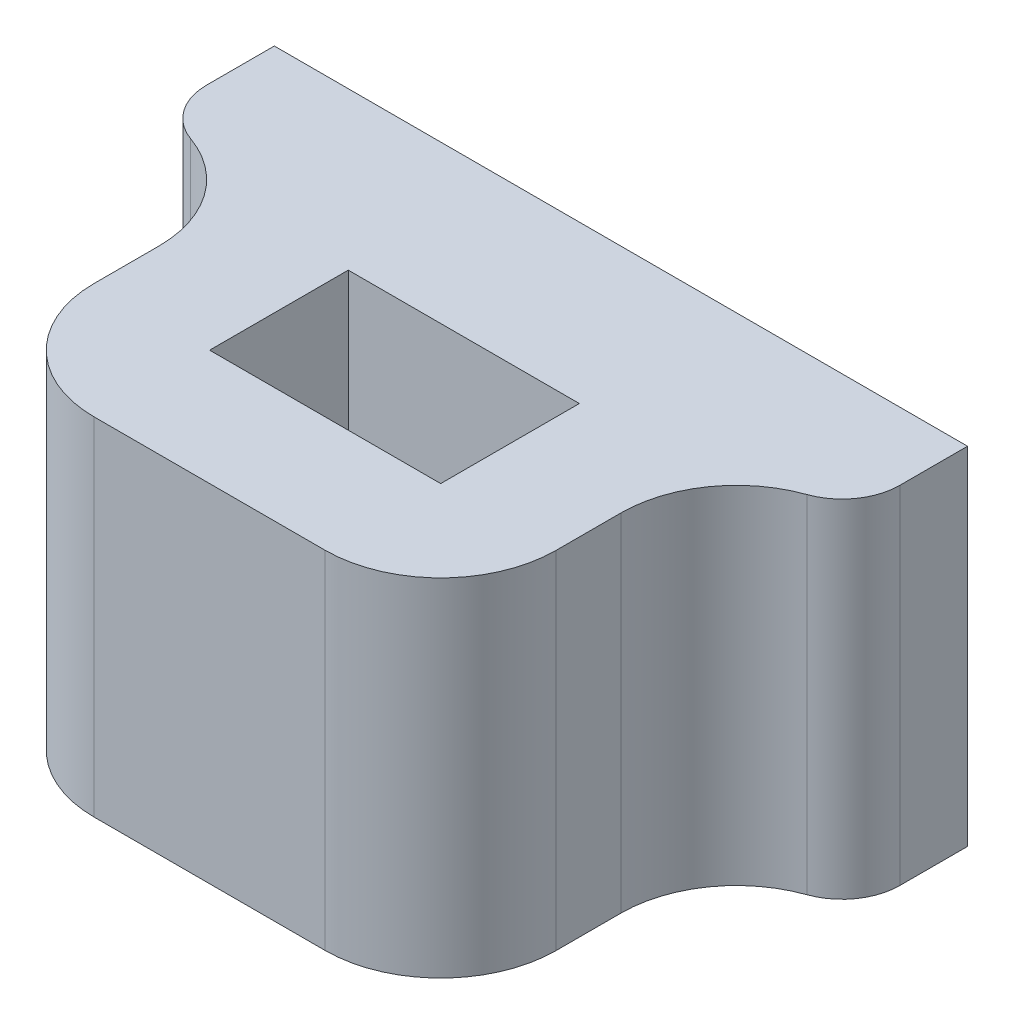
ISO-10303-21;
HEADER;
FILE_DESCRIPTION(('STEP AP214'),'2;1');
FILE_NAME('part.step','',(''),(''),'','','');
FILE_SCHEMA(('AUTOMOTIVE_DESIGN { 1 0 10303 214 1 1 1 1 }'));
ENDSEC;
DATA;
#1=APPLICATION_CONTEXT('core data for automotive mechanical design processes');
#2=APPLICATION_PROTOCOL_DEFINITION('international standard','automotive_design',2000,#1);
#3=PRODUCT_CONTEXT('',#1,'mechanical');
#4=PRODUCT('Part','Part','',(#3));
#5=PRODUCT_RELATED_PRODUCT_CATEGORY('part','',(#4));
#6=PRODUCT_DEFINITION_FORMATION('','',#4);
#7=PRODUCT_DEFINITION_CONTEXT('part definition',#1,'design');
#8=PRODUCT_DEFINITION('design','',#6,#7);
#9=PRODUCT_DEFINITION_SHAPE('','',#8);
#10=(LENGTH_UNIT() NAMED_UNIT(*) SI_UNIT(.MILLI.,.METRE.));
#11=(NAMED_UNIT(*) PLANE_ANGLE_UNIT() SI_UNIT($,.RADIAN.));
#12=(NAMED_UNIT(*) SI_UNIT($,.STERADIAN.) SOLID_ANGLE_UNIT());
#13=UNCERTAINTY_MEASURE_WITH_UNIT(LENGTH_MEASURE(1.E-05),#10,'distance_accuracy_value','');
#14=(GEOMETRIC_REPRESENTATION_CONTEXT(3) GLOBAL_UNCERTAINTY_ASSIGNED_CONTEXT((#13)) GLOBAL_UNIT_ASSIGNED_CONTEXT((#10,
#11,#12)) REPRESENTATION_CONTEXT('',''));
#15=CARTESIAN_POINT('',(0.,0.,0.));
#16=DIRECTION('',(0.,0.,1.));
#17=DIRECTION('',(1.,0.,0.));
#18=AXIS2_PLACEMENT_3D('',#15,#16,#17);
#19=CARTESIAN_POINT('',(9.525,4.7625,3.175));
#20=DIRECTION('',(-1.,0.,0.));
#21=DIRECTION('',(0.,-1.,0.));
#22=AXIS2_PLACEMENT_3D('',#19,#20,#21);
#23=PLANE('',#22);
#24=DIRECTION('',(0.,0.,-1.));
#25=VECTOR('',#24,1.);
#26=CARTESIAN_POINT('',(9.525,4.7625,3.175));
#27=LINE('',#26,#25);
#28=CARTESIAN_POINT('',(9.525,4.7625,1.85987193946542));
#29=VERTEX_POINT('',#28);
#30=CARTESIAN_POINT('',(9.525,4.7625,0.));
#31=VERTEX_POINT('',#30);
#32=EDGE_CURVE('E228',#29,#31,#27,.T.);
#33=ORIENTED_EDGE('',*,*,#32,.F.);
#34=DIRECTION('',(0.,1.,0.));
#35=VECTOR('',#34,1.);
#36=CARTESIAN_POINT('',(9.525,4.7625,1.85987193946542));
#37=LINE('',#36,#35);
#38=CARTESIAN_POINT('',(9.525,-4.7625,1.85987193946542));
#39=VERTEX_POINT('',#38);
#40=EDGE_CURVE('E11',#29,#39,#37,.F.);
#41=ORIENTED_EDGE('',*,*,#40,.T.);
#42=DIRECTION('',(0.,0.,-1.));
#43=VECTOR('',#42,1.);
#44=CARTESIAN_POINT('',(9.525,-4.7625,3.175));
#45=LINE('',#44,#43);
#46=CARTESIAN_POINT('',(9.525,-4.7625,0.));
#47=VERTEX_POINT('',#46);
#48=EDGE_CURVE('E222',#39,#47,#45,.T.);
#49=ORIENTED_EDGE('',*,*,#48,.T.);
#50=DIRECTION('',(0.,1.,0.));
#51=VECTOR('',#50,1.);
#52=CARTESIAN_POINT('',(9.525,4.7625,0.));
#53=LINE('',#52,#51);
#54=EDGE_CURVE('E210',#47,#31,#53,.T.);
#55=ORIENTED_EDGE('',*,*,#54,.T.);
#56=EDGE_LOOP('',(#33,#41,#49,#55));
#57=FACE_BOUND('',#56,.T.);
#58=ADVANCED_FACE('F38',(#57),#23,.F.);
#59=CARTESIAN_POINT('',(-9.525,4.7625,3.175));
#60=DIRECTION('',(0.,-1.,0.));
#61=DIRECTION('',(0.,0.,-1.));
#62=AXIS2_PLACEMENT_3D('',#59,#60,#61);
#63=PLANE('',#62);
#64=DIRECTION('',(1.,0.,0.));
#65=VECTOR('',#64,1.);
#66=CARTESIAN_POINT('',(-3.175,4.7625,4.318));
#67=LINE('',#66,#65);
#68=CARTESIAN_POINT('',(-3.175,4.7625,4.318));
#69=VERTEX_POINT('',#68);
#70=CARTESIAN_POINT('',(3.175,4.7625,4.318));
#71=VERTEX_POINT('',#70);
#72=EDGE_CURVE('E162',#69,#71,#67,.T.);
#73=ORIENTED_EDGE('',*,*,#72,.T.);
#74=DIRECTION('',(0.,0.,1.));
#75=VECTOR('',#74,1.);
#76=CARTESIAN_POINT('',(3.175,4.7625,8.128));
#77=LINE('',#76,#75);
#78=CARTESIAN_POINT('',(3.175,4.7625,8.128));
#79=VERTEX_POINT('',#78);
#80=EDGE_CURVE('E154',#71,#79,#77,.T.);
#81=ORIENTED_EDGE('',*,*,#80,.T.);
#82=DIRECTION('',(-1.,0.,0.));
#83=VECTOR('',#82,1.);
#84=CARTESIAN_POINT('',(-3.175,4.7625,8.128));
#85=LINE('',#84,#83);
#86=CARTESIAN_POINT('',(-3.175,4.7625,8.128));
#87=VERTEX_POINT('',#86);
#88=EDGE_CURVE('E166',#79,#87,#85,.T.);
#89=ORIENTED_EDGE('',*,*,#88,.T.);
#90=DIRECTION('',(0.,0.,-1.));
#91=VECTOR('',#90,1.);
#92=CARTESIAN_POINT('',(-3.175,4.7625,8.128));
#93=LINE('',#92,#91);
#94=EDGE_CURVE('E170',#87,#69,#93,.T.);
#95=ORIENTED_EDGE('',*,*,#94,.T.);
#96=EDGE_LOOP('',(#73,#81,#89,#95));
#97=FACE_BOUND('',#96,.T.);
#98=DIRECTION('',(0.,0.,-1.));
#99=VECTOR('',#98,1.);
#100=CARTESIAN_POINT('',(-9.525,4.7625,3.175));
#101=LINE('',#100,#99);
#102=CARTESIAN_POINT('',(-9.525,4.7625,1.85987193946542));
#103=VERTEX_POINT('',#102);
#104=CARTESIAN_POINT('',(-9.525,4.7625,0.));
#105=VERTEX_POINT('',#104);
#106=EDGE_CURVE('E226',#103,#105,#101,.T.);
#107=ORIENTED_EDGE('',*,*,#106,.F.);
#108=CARTESIAN_POINT('',(-7.9375,4.7625,1.85987193946542));
#109=DIRECTION('',(0.,-1.,0.));
#110=DIRECTION('',(0.,0.,-1.));
#111=AXIS2_PLACEMENT_3D('',#108,#109,#110);
#112=CIRCLE('',#111,1.5875);
#113=CARTESIAN_POINT('',(-8.46666666666667,4.7625,3.35658129297695));
#114=VERTEX_POINT('',#113);
#115=EDGE_CURVE('E273',#103,#114,#112,.F.);
#116=ORIENTED_EDGE('',*,*,#115,.T.);
#117=CARTESIAN_POINT('',(-9.525,4.7625,6.35));
#118=DIRECTION('',(0.,-1.,0.));
#119=DIRECTION('',(0.,0.,-1.));
#120=AXIS2_PLACEMENT_3D('',#117,#118,#119);
#121=CIRCLE('',#120,3.175);
#122=CARTESIAN_POINT('',(-6.35,4.7625,6.35));
#123=VERTEX_POINT('',#122);
#124=EDGE_CURVE('E261',#114,#123,#121,.T.);
#125=ORIENTED_EDGE('',*,*,#124,.T.);
#126=DIRECTION('',(0.,0.,-1.));
#127=VECTOR('',#126,1.);
#128=CARTESIAN_POINT('',(-6.35,4.7625,11.303));
#129=LINE('',#128,#127);
#130=CARTESIAN_POINT('',(-6.35,4.7625,8.128));
#131=VERTEX_POINT('',#130);
#132=EDGE_CURVE('E204',#131,#123,#129,.T.);
#133=ORIENTED_EDGE('',*,*,#132,.F.);
#134=CARTESIAN_POINT('',(-3.175,4.7625,8.128));
#135=DIRECTION('',(0.,-1.,0.));
#136=DIRECTION('',(0.,0.,-1.));
#137=AXIS2_PLACEMENT_3D('',#134,#135,#136);
#138=CIRCLE('',#137,3.175);
#139=CARTESIAN_POINT('',(-3.175,4.7625,11.303));
#140=VERTEX_POINT('',#139);
#141=EDGE_CURVE('E247',#131,#140,#138,.F.);
#142=ORIENTED_EDGE('',*,*,#141,.T.);
#143=DIRECTION('',(-1.,0.,0.));
#144=VECTOR('',#143,1.);
#145=CARTESIAN_POINT('',(-6.35,4.7625,11.303));
#146=LINE('',#145,#144);
#147=CARTESIAN_POINT('',(3.175,4.7625,11.303));
#148=VERTEX_POINT('',#147);
#149=EDGE_CURVE('E189',#148,#140,#146,.T.);
#150=ORIENTED_EDGE('',*,*,#149,.F.);
#151=CARTESIAN_POINT('',(3.175,4.7625,8.128));
#152=DIRECTION('',(0.,-1.,0.));
#153=DIRECTION('',(0.,0.,-1.));
#154=AXIS2_PLACEMENT_3D('',#151,#152,#153);
#155=CIRCLE('',#154,3.175);
#156=CARTESIAN_POINT('',(6.35,4.7625,8.128));
#157=VERTEX_POINT('',#156);
#158=EDGE_CURVE('E245',#148,#157,#155,.F.);
#159=ORIENTED_EDGE('',*,*,#158,.T.);
#160=DIRECTION('',(0.,0.,-1.));
#161=VECTOR('',#160,1.);
#162=CARTESIAN_POINT('',(6.35,4.7625,11.303));
#163=LINE('',#162,#161);
#164=CARTESIAN_POINT('',(6.35,4.7625,6.35));
#165=VERTEX_POINT('',#164);
#166=EDGE_CURVE('E207',#157,#165,#163,.T.);
#167=ORIENTED_EDGE('',*,*,#166,.T.);
#168=CARTESIAN_POINT('',(9.525,4.7625,6.35));
#169=DIRECTION('',(0.,-1.,0.));
#170=DIRECTION('',(0.,0.,-1.));
#171=AXIS2_PLACEMENT_3D('',#168,#169,#170);
#172=CIRCLE('',#171,3.175);
#173=CARTESIAN_POINT('',(8.46666666666666,4.7625,3.35658129297695));
#174=VERTEX_POINT('',#173);
#175=EDGE_CURVE('E254',#165,#174,#172,.T.);
#176=ORIENTED_EDGE('',*,*,#175,.T.);
#177=CARTESIAN_POINT('',(7.9375,4.7625,1.85987193946542));
#178=DIRECTION('',(0.,-1.,0.));
#179=DIRECTION('',(0.,0.,-1.));
#180=AXIS2_PLACEMENT_3D('',#177,#178,#179);
#181=CIRCLE('',#180,1.5875);
#182=EDGE_CURVE('E53',#174,#29,#181,.F.);
#183=ORIENTED_EDGE('',*,*,#182,.T.);
#184=ORIENTED_EDGE('',*,*,#32,.T.);
#185=DIRECTION('',(-1.,0.,0.));
#186=VECTOR('',#185,1.);
#187=CARTESIAN_POINT('',(-9.525,4.7625,0.));
#188=LINE('',#187,#186);
#189=EDGE_CURVE('E213',#31,#105,#188,.T.);
#190=ORIENTED_EDGE('',*,*,#189,.T.);
#191=EDGE_LOOP('',(#107,#116,#125,#133,#142,#150,#159,#167,#176,#183,#184,#190));
#192=FACE_BOUND('',#191,.T.);
#193=ADVANCED_FACE('F172',(#97,#192),#63,.F.);
#194=CARTESIAN_POINT('',(-9.525,4.7625,3.175));
#195=DIRECTION('',(1.,0.,0.));
#196=DIRECTION('',(0.,1.,0.));
#197=AXIS2_PLACEMENT_3D('',#194,#195,#196);
#198=PLANE('',#197);
#199=DIRECTION('',(0.,0.,-1.));
#200=VECTOR('',#199,1.);
#201=CARTESIAN_POINT('',(-9.525,-4.7625,3.175));
#202=LINE('',#201,#200);
#203=CARTESIAN_POINT('',(-9.525,-4.7625,1.85987193946542));
#204=VERTEX_POINT('',#203);
#205=CARTESIAN_POINT('',(-9.525,-4.7625,0.));
#206=VERTEX_POINT('',#205);
#207=EDGE_CURVE('E224',#204,#206,#202,.T.);
#208=ORIENTED_EDGE('',*,*,#207,.F.);
#209=DIRECTION('',(0.,-1.,0.));
#210=VECTOR('',#209,1.);
#211=CARTESIAN_POINT('',(-9.525,4.7625,1.85987193946542));
#212=LINE('',#211,#210);
#213=EDGE_CURVE('E270',#204,#103,#212,.F.);
#214=ORIENTED_EDGE('',*,*,#213,.T.);
#215=ORIENTED_EDGE('',*,*,#106,.T.);
#216=DIRECTION('',(0.,-1.,0.));
#217=VECTOR('',#216,1.);
#218=CARTESIAN_POINT('',(-9.525,4.7625,0.));
#219=LINE('',#218,#217);
#220=EDGE_CURVE('E216',#105,#206,#219,.T.);
#221=ORIENTED_EDGE('',*,*,#220,.T.);
#222=EDGE_LOOP('',(#208,#214,#215,#221));
#223=FACE_BOUND('',#222,.T.);
#224=ADVANCED_FACE('F313',(#223),#198,.F.);
#225=CARTESIAN_POINT('',(-9.525,-4.7625,3.175));
#226=DIRECTION('',(0.,1.,0.));
#227=DIRECTION('',(0.,0.,1.));
#228=AXIS2_PLACEMENT_3D('',#225,#226,#227);
#229=PLANE('',#228);
#230=DIRECTION('',(-1.,0.,0.));
#231=VECTOR('',#230,1.);
#232=CARTESIAN_POINT('',(-3.175,-4.7625,8.128));
#233=LINE('',#232,#231);
#234=CARTESIAN_POINT('',(3.175,-4.7625,8.128));
#235=VERTEX_POINT('',#234);
#236=CARTESIAN_POINT('',(-3.175,-4.7625,8.128));
#237=VERTEX_POINT('',#236);
#238=EDGE_CURVE('E183',#235,#237,#233,.T.);
#239=ORIENTED_EDGE('',*,*,#238,.F.);
#240=DIRECTION('',(0.,0.,1.));
#241=VECTOR('',#240,1.);
#242=CARTESIAN_POINT('',(3.175,-4.7625,8.128));
#243=LINE('',#242,#241);
#244=CARTESIAN_POINT('',(3.175,-4.7625,4.318));
#245=VERTEX_POINT('',#244);
#246=EDGE_CURVE('E157',#245,#235,#243,.T.);
#247=ORIENTED_EDGE('',*,*,#246,.F.);
#248=DIRECTION('',(1.,0.,0.));
#249=VECTOR('',#248,1.);
#250=CARTESIAN_POINT('',(-3.175,-4.7625,4.318));
#251=LINE('',#250,#249);
#252=CARTESIAN_POINT('',(-3.175,-4.7625,4.318));
#253=VERTEX_POINT('',#252);
#254=EDGE_CURVE('E174',#253,#245,#251,.T.);
#255=ORIENTED_EDGE('',*,*,#254,.F.);
#256=DIRECTION('',(0.,0.,-1.));
#257=VECTOR('',#256,1.);
#258=CARTESIAN_POINT('',(-3.175,-4.7625,8.128));
#259=LINE('',#258,#257);
#260=EDGE_CURVE('E177',#237,#253,#259,.T.);
#261=ORIENTED_EDGE('',*,*,#260,.F.);
#262=EDGE_LOOP('',(#239,#247,#255,#261));
#263=FACE_BOUND('',#262,.T.);
#264=CARTESIAN_POINT('',(-9.525,-4.7625,6.35));
#265=DIRECTION('',(0.,1.,0.));
#266=DIRECTION('',(0.,0.,1.));
#267=AXIS2_PLACEMENT_3D('',#264,#265,#266);
#268=CIRCLE('',#267,3.175);
#269=CARTESIAN_POINT('',(-6.35,-4.7625,6.35));
#270=VERTEX_POINT('',#269);
#271=CARTESIAN_POINT('',(-8.46666666666667,-4.7625,3.35658129297695));
#272=VERTEX_POINT('',#271);
#273=EDGE_CURVE('E258',#270,#272,#268,.T.);
#274=ORIENTED_EDGE('',*,*,#273,.T.);
#275=CARTESIAN_POINT('',(-7.9375,-4.7625,1.85987193946542));
#276=DIRECTION('',(0.,1.,0.));
#277=DIRECTION('',(0.,0.,1.));
#278=AXIS2_PLACEMENT_3D('',#275,#276,#277);
#279=CIRCLE('',#278,1.5875);
#280=EDGE_CURVE('E268',#272,#204,#279,.F.);
#281=ORIENTED_EDGE('',*,*,#280,.T.);
#282=ORIENTED_EDGE('',*,*,#207,.T.);
#283=DIRECTION('',(1.,0.,0.));
#284=VECTOR('',#283,1.);
#285=CARTESIAN_POINT('',(-9.525,-4.7625,0.));
#286=LINE('',#285,#284);
#287=EDGE_CURVE('E219',#206,#47,#286,.T.);
#288=ORIENTED_EDGE('',*,*,#287,.T.);
#289=ORIENTED_EDGE('',*,*,#48,.F.);
#290=CARTESIAN_POINT('',(7.9375,-4.7625,1.85987193946542));
#291=DIRECTION('',(0.,1.,0.));
#292=DIRECTION('',(0.,0.,1.));
#293=AXIS2_PLACEMENT_3D('',#290,#291,#292);
#294=CIRCLE('',#293,1.5875);
#295=CARTESIAN_POINT('',(8.46666666666666,-4.7625,3.35658129297695));
#296=VERTEX_POINT('',#295);
#297=EDGE_CURVE('E266',#39,#296,#294,.F.);
#298=ORIENTED_EDGE('',*,*,#297,.T.);
#299=CARTESIAN_POINT('',(9.525,-4.7625,6.35));
#300=DIRECTION('',(0.,1.,0.));
#301=DIRECTION('',(0.,0.,1.));
#302=AXIS2_PLACEMENT_3D('',#299,#300,#301);
#303=CIRCLE('',#302,3.175);
#304=CARTESIAN_POINT('',(6.35,-4.7625,6.35));
#305=VERTEX_POINT('',#304);
#306=EDGE_CURVE('E256',#296,#305,#303,.T.);
#307=ORIENTED_EDGE('',*,*,#306,.T.);
#308=DIRECTION('',(0.,0.,-1.));
#309=VECTOR('',#308,1.);
#310=CARTESIAN_POINT('',(6.35,-4.7625,11.303));
#311=LINE('',#310,#309);
#312=CARTESIAN_POINT('',(6.35,-4.7625,8.128));
#313=VERTEX_POINT('',#312);
#314=EDGE_CURVE('E198',#313,#305,#311,.T.);
#315=ORIENTED_EDGE('',*,*,#314,.F.);
#316=CARTESIAN_POINT('',(3.175,-4.7625,8.128));
#317=DIRECTION('',(0.,1.,0.));
#318=DIRECTION('',(0.,0.,1.));
#319=AXIS2_PLACEMENT_3D('',#316,#317,#318);
#320=CIRCLE('',#319,3.175);
#321=CARTESIAN_POINT('',(3.175,-4.7625,11.303));
#322=VERTEX_POINT('',#321);
#323=EDGE_CURVE('E236',#313,#322,#320,.F.);
#324=ORIENTED_EDGE('',*,*,#323,.T.);
#325=DIRECTION('',(1.,0.,0.));
#326=VECTOR('',#325,1.);
#327=CARTESIAN_POINT('',(-6.35,-4.7625,11.303));
#328=LINE('',#327,#326);
#329=CARTESIAN_POINT('',(-3.175,-4.7625,11.303));
#330=VERTEX_POINT('',#329);
#331=EDGE_CURVE('E195',#330,#322,#328,.T.);
#332=ORIENTED_EDGE('',*,*,#331,.F.);
#333=CARTESIAN_POINT('',(-3.175,-4.7625,8.128));
#334=DIRECTION('',(0.,1.,0.));
#335=DIRECTION('',(0.,0.,1.));
#336=AXIS2_PLACEMENT_3D('',#333,#334,#335);
#337=CIRCLE('',#336,3.175);
#338=CARTESIAN_POINT('',(-6.35,-4.7625,8.128));
#339=VERTEX_POINT('',#338);
#340=EDGE_CURVE('E238',#330,#339,#337,.F.);
#341=ORIENTED_EDGE('',*,*,#340,.T.);
#342=DIRECTION('',(0.,0.,-1.));
#343=VECTOR('',#342,1.);
#344=CARTESIAN_POINT('',(-6.35,-4.7625,11.303));
#345=LINE('',#344,#343);
#346=EDGE_CURVE('E201',#339,#270,#345,.T.);
#347=ORIENTED_EDGE('',*,*,#346,.T.);
#348=EDGE_LOOP('',(#274,#281,#282,#288,#289,#298,#307,#315,#324,#332,#341,#347));
#349=FACE_BOUND('',#348,.T.);
#350=ADVANCED_FACE('F292',(#263,#349),#229,.F.);
#351=CARTESIAN_POINT('',(0.,0.,0.));
#352=DIRECTION('',(0.,0.,1.));
#353=DIRECTION('',(1.,0.,0.));
#354=AXIS2_PLACEMENT_3D('',#351,#352,#353);
#355=PLANE('',#354);
#356=ORIENTED_EDGE('',*,*,#54,.F.);
#357=ORIENTED_EDGE('',*,*,#287,.F.);
#358=ORIENTED_EDGE('',*,*,#220,.F.);
#359=ORIENTED_EDGE('',*,*,#189,.F.);
#360=EDGE_LOOP('',(#356,#357,#358,#359));
#361=FACE_BOUND('',#360,.T.);
#362=ADVANCED_FACE('F321',(#361),#355,.F.);
#363=CARTESIAN_POINT('',(6.35,4.7625,11.303));
#364=DIRECTION('',(-1.,0.,0.));
#365=DIRECTION('',(0.,0.,1.));
#366=AXIS2_PLACEMENT_3D('',#363,#364,#365);
#367=PLANE('',#366);
#368=ORIENTED_EDGE('',*,*,#166,.F.);
#369=DIRECTION('',(0.,1.,0.));
#370=VECTOR('',#369,1.);
#371=CARTESIAN_POINT('',(6.35,-4.7625,8.128));
#372=LINE('',#371,#370);
#373=EDGE_CURVE('E252',#157,#313,#372,.F.);
#374=ORIENTED_EDGE('',*,*,#373,.T.);
#375=ORIENTED_EDGE('',*,*,#314,.T.);
#376=DIRECTION('',(0.,1.,0.));
#377=VECTOR('',#376,1.);
#378=CARTESIAN_POINT('',(6.35,4.7625,6.35));
#379=LINE('',#378,#377);
#380=EDGE_CURVE('E249',#305,#165,#379,.T.);
#381=ORIENTED_EDGE('',*,*,#380,.T.);
#382=EDGE_LOOP('',(#368,#374,#375,#381));
#383=FACE_BOUND('',#382,.T.);
#384=ADVANCED_FACE('F284',(#383),#367,.F.);
#385=CARTESIAN_POINT('',(-6.35,4.7625,11.303));
#386=DIRECTION('',(1.,0.,0.));
#387=DIRECTION('',(0.,0.,-1.));
#388=AXIS2_PLACEMENT_3D('',#385,#386,#387);
#389=PLANE('',#388);
#390=ORIENTED_EDGE('',*,*,#346,.F.);
#391=DIRECTION('',(0.,-1.,0.));
#392=VECTOR('',#391,1.);
#393=CARTESIAN_POINT('',(-6.35,4.7625,8.128));
#394=LINE('',#393,#392);
#395=EDGE_CURVE('E243',#339,#131,#394,.F.);
#396=ORIENTED_EDGE('',*,*,#395,.T.);
#397=ORIENTED_EDGE('',*,*,#132,.T.);
#398=DIRECTION('',(0.,-1.,0.));
#399=VECTOR('',#398,1.);
#400=CARTESIAN_POINT('',(-6.35,4.7625,6.35));
#401=LINE('',#400,#399);
#402=EDGE_CURVE('E240',#123,#270,#401,.T.);
#403=ORIENTED_EDGE('',*,*,#402,.T.);
#404=EDGE_LOOP('',(#390,#396,#397,#403));
#405=FACE_BOUND('',#404,.T.);
#406=ADVANCED_FACE('F302',(#405),#389,.F.);
#407=CARTESIAN_POINT('',(0.,0.,11.303));
#408=DIRECTION('',(0.,0.,1.));
#409=DIRECTION('',(1.,0.,0.));
#410=AXIS2_PLACEMENT_3D('',#407,#408,#409);
#411=PLANE('',#410);
#412=ORIENTED_EDGE('',*,*,#149,.T.);
#413=DIRECTION('',(0.,-1.,0.));
#414=VECTOR('',#413,1.);
#415=CARTESIAN_POINT('',(-3.175,-4.7625,11.303));
#416=LINE('',#415,#414);
#417=EDGE_CURVE('E233',#140,#330,#416,.T.);
#418=ORIENTED_EDGE('',*,*,#417,.T.);
#419=ORIENTED_EDGE('',*,*,#331,.T.);
#420=DIRECTION('',(0.,1.,0.));
#421=VECTOR('',#420,1.);
#422=CARTESIAN_POINT('',(3.175,4.7625,11.303));
#423=LINE('',#422,#421);
#424=EDGE_CURVE('E230',#322,#148,#423,.T.);
#425=ORIENTED_EDGE('',*,*,#424,.T.);
#426=EDGE_LOOP('',(#412,#418,#419,#425));
#427=FACE_BOUND('',#426,.T.);
#428=ADVANCED_FACE('F294',(#427),#411,.T.);
#429=CARTESIAN_POINT('',(3.175,4.7625,8.128));
#430=DIRECTION('',(1.,0.,0.));
#431=DIRECTION('',(0.,0.,-1.));
#432=AXIS2_PLACEMENT_3D('',#429,#430,#431);
#433=PLANE('',#432);
#434=ORIENTED_EDGE('',*,*,#246,.T.);
#435=DIRECTION('',(0.,-1.,0.));
#436=VECTOR('',#435,1.);
#437=CARTESIAN_POINT('',(3.175,4.7625,8.128));
#438=LINE('',#437,#436);
#439=EDGE_CURVE('E150',#79,#235,#438,.T.);
#440=ORIENTED_EDGE('',*,*,#439,.F.);
#441=ORIENTED_EDGE('',*,*,#80,.F.);
#442=DIRECTION('',(0.,-1.,0.));
#443=VECTOR('',#442,1.);
#444=CARTESIAN_POINT('',(3.175,4.7625,4.318));
#445=LINE('',#444,#443);
#446=EDGE_CURVE('E187',#71,#245,#445,.T.);
#447=ORIENTED_EDGE('',*,*,#446,.T.);
#448=EDGE_LOOP('',(#434,#440,#441,#447));
#449=FACE_BOUND('',#448,.T.);
#450=ADVANCED_FACE('F152',(#449),#433,.F.);
#451=CARTESIAN_POINT('',(-3.175,4.7625,4.318));
#452=DIRECTION('',(0.,0.,-1.));
#453=DIRECTION('',(-1.,0.,0.));
#454=AXIS2_PLACEMENT_3D('',#451,#452,#453);
#455=PLANE('',#454);
#456=ORIENTED_EDGE('',*,*,#254,.T.);
#457=ORIENTED_EDGE('',*,*,#446,.F.);
#458=ORIENTED_EDGE('',*,*,#72,.F.);
#459=DIRECTION('',(0.,-1.,0.));
#460=VECTOR('',#459,1.);
#461=CARTESIAN_POINT('',(-3.175,4.7625,4.318));
#462=LINE('',#461,#460);
#463=EDGE_CURVE('E190',#69,#253,#462,.T.);
#464=ORIENTED_EDGE('',*,*,#463,.T.);
#465=EDGE_LOOP('',(#456,#457,#458,#464));
#466=FACE_BOUND('',#465,.T.);
#467=ADVANCED_FACE('F422',(#466),#455,.F.);
#468=CARTESIAN_POINT('',(-3.175,4.7625,8.128));
#469=DIRECTION('',(-1.,0.,0.));
#470=DIRECTION('',(0.,0.,1.));
#471=AXIS2_PLACEMENT_3D('',#468,#469,#470);
#472=PLANE('',#471);
#473=ORIENTED_EDGE('',*,*,#260,.T.);
#474=ORIENTED_EDGE('',*,*,#463,.F.);
#475=ORIENTED_EDGE('',*,*,#94,.F.);
#476=DIRECTION('',(0.,-1.,0.));
#477=VECTOR('',#476,1.);
#478=CARTESIAN_POINT('',(-3.175,4.7625,8.128));
#479=LINE('',#478,#477);
#480=EDGE_CURVE('E161',#87,#237,#479,.T.);
#481=ORIENTED_EDGE('',*,*,#480,.T.);
#482=EDGE_LOOP('',(#473,#474,#475,#481));
#483=FACE_BOUND('',#482,.T.);
#484=ADVANCED_FACE('F434',(#483),#472,.F.);
#485=CARTESIAN_POINT('',(-3.175,4.7625,8.128));
#486=DIRECTION('',(0.,0.,1.));
#487=DIRECTION('',(1.,0.,0.));
#488=AXIS2_PLACEMENT_3D('',#485,#486,#487);
#489=PLANE('',#488);
#490=ORIENTED_EDGE('',*,*,#238,.T.);
#491=ORIENTED_EDGE('',*,*,#480,.F.);
#492=ORIENTED_EDGE('',*,*,#88,.F.);
#493=ORIENTED_EDGE('',*,*,#439,.T.);
#494=EDGE_LOOP('',(#490,#491,#492,#493));
#495=FACE_BOUND('',#494,.T.);
#496=ADVANCED_FACE('F167',(#495),#489,.F.);
#497=CARTESIAN_POINT('',(-3.175,0.,8.128));
#498=DIRECTION('',(0.,1.,0.));
#499=DIRECTION('',(0.,0.,1.));
#500=AXIS2_PLACEMENT_3D('',#497,#498,#499);
#501=CYLINDRICAL_SURFACE('',#500,3.175);
#502=ORIENTED_EDGE('',*,*,#141,.F.);
#503=ORIENTED_EDGE('',*,*,#395,.F.);
#504=ORIENTED_EDGE('',*,*,#340,.F.);
#505=ORIENTED_EDGE('',*,*,#417,.F.);
#506=EDGE_LOOP('',(#502,#503,#504,#505));
#507=FACE_BOUND('',#506,.T.);
#508=ADVANCED_FACE('F298',(#507),#501,.T.);
#509=CARTESIAN_POINT('',(3.175,0.,8.128));
#510=DIRECTION('',(0.,-1.,0.));
#511=DIRECTION('',(0.,0.,-1.));
#512=AXIS2_PLACEMENT_3D('',#509,#510,#511);
#513=CYLINDRICAL_SURFACE('',#512,3.175);
#514=ORIENTED_EDGE('',*,*,#323,.F.);
#515=ORIENTED_EDGE('',*,*,#373,.F.);
#516=ORIENTED_EDGE('',*,*,#158,.F.);
#517=ORIENTED_EDGE('',*,*,#424,.F.);
#518=EDGE_LOOP('',(#514,#515,#516,#517));
#519=FACE_BOUND('',#518,.T.);
#520=ADVANCED_FACE('F288',(#519),#513,.T.);
#521=CARTESIAN_POINT('',(9.525,4.7625,6.35));
#522=DIRECTION('',(0.,1.,0.));
#523=DIRECTION('',(0.,0.,1.));
#524=AXIS2_PLACEMENT_3D('',#521,#522,#523);
#525=CYLINDRICAL_SURFACE('',#524,3.175);
#526=ORIENTED_EDGE('',*,*,#306,.F.);
#527=DIRECTION('',(0.,1.,0.));
#528=VECTOR('',#527,1.);
#529=CARTESIAN_POINT('',(8.46666666666666,4.7625,3.35658129297695));
#530=LINE('',#529,#528);
#531=EDGE_CURVE('E46',#296,#174,#530,.T.);
#532=ORIENTED_EDGE('',*,*,#531,.T.);
#533=ORIENTED_EDGE('',*,*,#175,.F.);
#534=ORIENTED_EDGE('',*,*,#380,.F.);
#535=EDGE_LOOP('',(#526,#532,#533,#534));
#536=FACE_BOUND('',#535,.T.);
#537=ADVANCED_FACE('F276',(#536),#525,.F.);
#538=CARTESIAN_POINT('',(-9.525,4.7625,6.35));
#539=DIRECTION('',(0.,-1.,0.));
#540=DIRECTION('',(0.,0.,-1.));
#541=AXIS2_PLACEMENT_3D('',#538,#539,#540);
#542=CYLINDRICAL_SURFACE('',#541,3.175);
#543=ORIENTED_EDGE('',*,*,#124,.F.);
#544=DIRECTION('',(0.,-1.,0.));
#545=VECTOR('',#544,1.);
#546=CARTESIAN_POINT('',(-8.46666666666667,4.7625,3.35658129297695));
#547=LINE('',#546,#545);
#548=EDGE_CURVE('E263',#114,#272,#547,.T.);
#549=ORIENTED_EDGE('',*,*,#548,.T.);
#550=ORIENTED_EDGE('',*,*,#273,.F.);
#551=ORIENTED_EDGE('',*,*,#402,.F.);
#552=EDGE_LOOP('',(#543,#549,#550,#551));
#553=FACE_BOUND('',#552,.T.);
#554=ADVANCED_FACE('F307',(#553),#542,.F.);
#555=CARTESIAN_POINT('',(-7.9375,4.7625,1.85987193946542));
#556=DIRECTION('',(0.,-1.,0.));
#557=DIRECTION('',(0.,0.,-1.));
#558=AXIS2_PLACEMENT_3D('',#555,#556,#557);
#559=CYLINDRICAL_SURFACE('',#558,1.5875);
#560=ORIENTED_EDGE('',*,*,#115,.F.);
#561=ORIENTED_EDGE('',*,*,#213,.F.);
#562=ORIENTED_EDGE('',*,*,#280,.F.);
#563=ORIENTED_EDGE('',*,*,#548,.F.);
#564=EDGE_LOOP('',(#560,#561,#562,#563));
#565=FACE_BOUND('',#564,.T.);
#566=ADVANCED_FACE('F317',(#565),#559,.T.);
#567=CARTESIAN_POINT('',(7.9375,4.7625,1.85987193946542));
#568=DIRECTION('',(0.,1.,0.));
#569=DIRECTION('',(0.,0.,1.));
#570=AXIS2_PLACEMENT_3D('',#567,#568,#569);
#571=CYLINDRICAL_SURFACE('',#570,1.5875);
#572=ORIENTED_EDGE('',*,*,#297,.F.);
#573=ORIENTED_EDGE('',*,*,#40,.F.);
#574=ORIENTED_EDGE('',*,*,#182,.F.);
#575=ORIENTED_EDGE('',*,*,#531,.F.);
#576=EDGE_LOOP('',(#572,#573,#574,#575));
#577=FACE_BOUND('',#576,.T.);
#578=ADVANCED_FACE('F40',(#577),#571,.T.);
#579=CLOSED_SHELL('',(#58,#193,#224,#350,#362,#384,#406,#428,#450,#467,#484,#496,#508,#520,#537,
#554,#566,#578));
#580=MANIFOLD_SOLID_BREP('B2',#579);
#581=ADVANCED_BREP_SHAPE_REPRESENTATION('',(#18,#580),#14);
#582=SHAPE_DEFINITION_REPRESENTATION(#9,#581);
ENDSEC;
END-ISO-10303-21;
